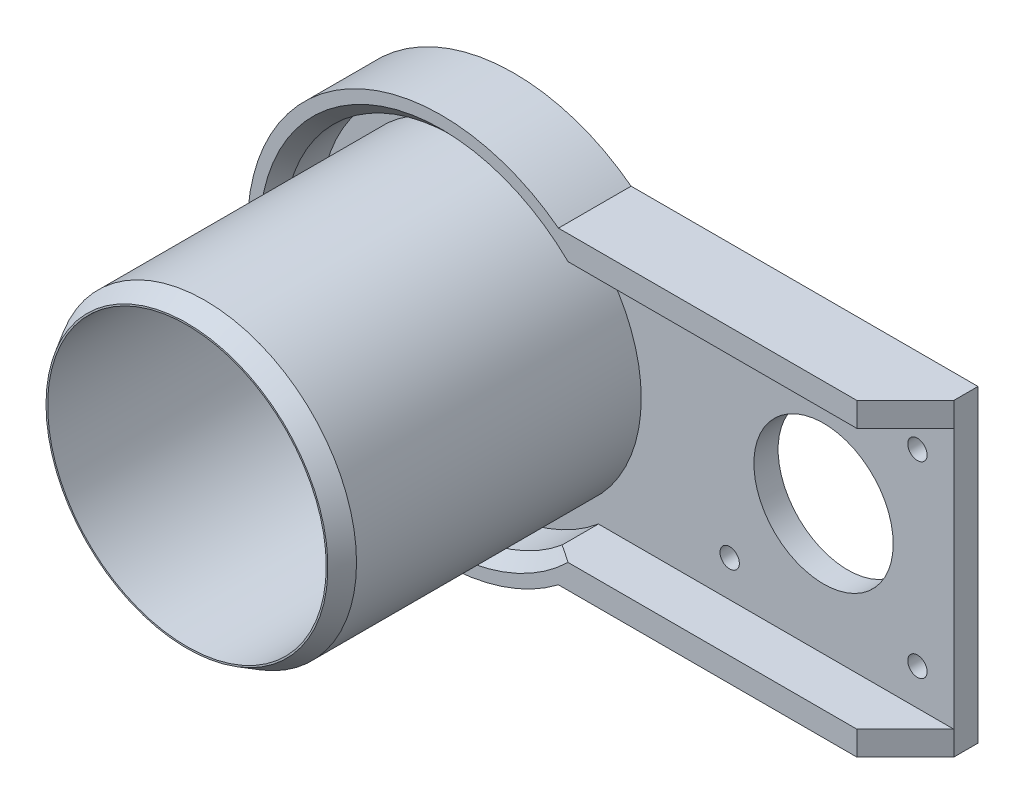
ISO-10303-21;
HEADER;
FILE_DESCRIPTION(('STEP AP214'),'2;1');
FILE_NAME('part.step','',(''),(''),'','','');
FILE_SCHEMA(('AUTOMOTIVE_DESIGN { 1 0 10303 214 1 1 1 1 }'));
ENDSEC;
DATA;
#1=APPLICATION_CONTEXT('core data for automotive mechanical design processes');
#2=APPLICATION_PROTOCOL_DEFINITION('international standard','automotive_design',2000,#1);
#3=PRODUCT_CONTEXT('',#1,'mechanical');
#4=PRODUCT('Part','Part','',(#3));
#5=PRODUCT_RELATED_PRODUCT_CATEGORY('part','',(#4));
#6=PRODUCT_DEFINITION_FORMATION('','',#4);
#7=PRODUCT_DEFINITION_CONTEXT('part definition',#1,'design');
#8=PRODUCT_DEFINITION('design','',#6,#7);
#9=PRODUCT_DEFINITION_SHAPE('','',#8);
#10=(LENGTH_UNIT() NAMED_UNIT(*) SI_UNIT(.MILLI.,.METRE.));
#11=(NAMED_UNIT(*) PLANE_ANGLE_UNIT() SI_UNIT($,.RADIAN.));
#12=(NAMED_UNIT(*) SI_UNIT($,.STERADIAN.) SOLID_ANGLE_UNIT());
#13=UNCERTAINTY_MEASURE_WITH_UNIT(LENGTH_MEASURE(1.E-05),#10,'distance_accuracy_value','');
#14=(GEOMETRIC_REPRESENTATION_CONTEXT(3) GLOBAL_UNCERTAINTY_ASSIGNED_CONTEXT((#13)) GLOBAL_UNIT_ASSIGNED_CONTEXT((#10,
#11,#12)) REPRESENTATION_CONTEXT('',''));
#15=CARTESIAN_POINT('',(0.,0.,0.));
#16=DIRECTION('',(0.,0.,1.));
#17=DIRECTION('',(1.,0.,0.));
#18=AXIS2_PLACEMENT_3D('',#15,#16,#17);
#19=CARTESIAN_POINT('',(0.,0.,4.));
#20=DIRECTION('',(0.,0.,1.));
#21=DIRECTION('',(1.,0.,0.));
#22=AXIS2_PLACEMENT_3D('',#19,#20,#21);
#23=PLANE('',#22);
#24=CARTESIAN_POINT('',(0.,0.,4.));
#25=DIRECTION('',(0.,0.,1.));
#26=DIRECTION('',(1.,0.,0.));
#27=AXIS2_PLACEMENT_3D('',#24,#25,#26);
#28=CIRCLE('',#27,25.);
#29=CARTESIAN_POINT('',(25.,0.,4.));
#30=VERTEX_POINT('',#29);
#31=EDGE_CURVE('E166',#30,#30,#28,.T.);
#32=ORIENTED_EDGE('',*,*,#31,.F.);
#33=EDGE_LOOP('',(#32));
#34=FACE_BOUND('',#33,.T.);
#35=CARTESIAN_POINT('',(70.6000000000003,-15.5,4.));
#36=DIRECTION('',(0.,0.,1.));
#37=DIRECTION('',(1.,0.,0.));
#38=AXIS2_PLACEMENT_3D('',#35,#36,#37);
#39=CIRCLE('',#38,1.59999999999999);
#40=CARTESIAN_POINT('',(72.2000000000003,-15.5,4.));
#41=VERTEX_POINT('',#40);
#42=EDGE_CURVE('E176',#41,#41,#39,.T.);
#43=ORIENTED_EDGE('',*,*,#42,.F.);
#44=EDGE_LOOP('',(#43));
#45=FACE_BOUND('',#44,.T.);
#46=CARTESIAN_POINT('',(39.6,15.5,4.));
#47=DIRECTION('',(0.,0.,1.));
#48=DIRECTION('',(1.,0.,0.));
#49=AXIS2_PLACEMENT_3D('',#46,#47,#48);
#50=CIRCLE('',#49,1.6);
#51=CARTESIAN_POINT('',(41.2,15.5,4.));
#52=VERTEX_POINT('',#51);
#53=EDGE_CURVE('E188',#52,#52,#50,.T.);
#54=ORIENTED_EDGE('',*,*,#53,.F.);
#55=EDGE_LOOP('',(#54));
#56=FACE_BOUND('',#55,.T.);
#57=CARTESIAN_POINT('',(55.1,0.,4.));
#58=DIRECTION('',(0.,0.,1.));
#59=DIRECTION('',(1.,0.,0.));
#60=AXIS2_PLACEMENT_3D('',#57,#58,#59);
#61=CIRCLE('',#60,11.5);
#62=CARTESIAN_POINT('',(66.6,0.,4.));
#63=VERTEX_POINT('',#62);
#64=EDGE_CURVE('E194',#63,#63,#61,.T.);
#65=ORIENTED_EDGE('',*,*,#64,.F.);
#66=EDGE_LOOP('',(#65));
#67=FACE_BOUND('',#66,.T.);
#68=CARTESIAN_POINT('',(70.6,15.5,4.));
#69=DIRECTION('',(0.,0.,1.));
#70=DIRECTION('',(1.,0.,0.));
#71=AXIS2_PLACEMENT_3D('',#68,#69,#70);
#72=CIRCLE('',#71,1.6);
#73=CARTESIAN_POINT('',(72.2,15.5,4.));
#74=VERTEX_POINT('',#73);
#75=EDGE_CURVE('E182',#74,#74,#72,.T.);
#76=ORIENTED_EDGE('',*,*,#75,.F.);
#77=EDGE_LOOP('',(#76));
#78=FACE_BOUND('',#77,.T.);
#79=CARTESIAN_POINT('',(39.6000000000003,-15.5,4.));
#80=DIRECTION('',(0.,0.,1.));
#81=DIRECTION('',(1.,0.,0.));
#82=AXIS2_PLACEMENT_3D('',#79,#80,#81);
#83=CIRCLE('',#82,1.6);
#84=CARTESIAN_POINT('',(41.2000000000003,-15.5,4.));
#85=VERTEX_POINT('',#84);
#86=EDGE_CURVE('E170',#85,#85,#83,.T.);
#87=ORIENTED_EDGE('',*,*,#86,.F.);
#88=EDGE_LOOP('',(#87));
#89=FACE_BOUND('',#88,.T.);
#90=CARTESIAN_POINT('',(0.,0.,4.));
#91=DIRECTION('',(0.,0.,-1.));
#92=DIRECTION('',(1.,0.,0.));
#93=AXIS2_PLACEMENT_3D('',#90,#91,#92);
#94=CIRCLE('',#93,28.);
#95=CARTESIAN_POINT('',(17.9373911146521,-21.5,4.));
#96=VERTEX_POINT('',#95);
#97=CARTESIAN_POINT('',(17.9373911146521,21.5,4.));
#98=VERTEX_POINT('',#97);
#99=EDGE_CURVE('E147',#96,#98,#94,.T.);
#100=ORIENTED_EDGE('',*,*,#99,.F.);
#101=DIRECTION('',(-1.,0.,0.));
#102=VECTOR('',#101,1.);
#103=CARTESIAN_POINT('',(17.9373911146521,-21.5,4.));
#104=LINE('',#103,#102);
#105=CARTESIAN_POINT('',(76.6,-21.5,4.));
#106=VERTEX_POINT('',#105);
#107=EDGE_CURVE('E155',#106,#96,#104,.T.);
#108=ORIENTED_EDGE('',*,*,#107,.F.);
#109=DIRECTION('',(0.,1.,0.));
#110=VECTOR('',#109,1.);
#111=CARTESIAN_POINT('',(76.6,25.5,4.));
#112=LINE('',#111,#110);
#113=CARTESIAN_POINT('',(76.6,21.5,4.));
#114=VERTEX_POINT('',#113);
#115=EDGE_CURVE('E205',#106,#114,#112,.T.);
#116=ORIENTED_EDGE('',*,*,#115,.T.);
#117=DIRECTION('',(1.,0.,0.));
#118=VECTOR('',#117,1.);
#119=CARTESIAN_POINT('',(76.6,21.5,4.));
#120=LINE('',#119,#118);
#121=EDGE_CURVE('E144',#98,#114,#120,.T.);
#122=ORIENTED_EDGE('',*,*,#121,.F.);
#123=EDGE_LOOP('',(#100,#108,#116,#122));
#124=FACE_BOUND('',#123,.T.);
#125=ADVANCED_FACE('F33',(#34,#45,#56,#67,#78,#89,#124),#23,.T.);
#126=CARTESIAN_POINT('',(0.,0.,4.));
#127=DIRECTION('',(0.,0.,1.));
#128=DIRECTION('',(1.,0.,0.));
#129=AXIS2_PLACEMENT_3D('',#126,#127,#128);
#130=CIRCLE('',#129,6.55);
#131=CARTESIAN_POINT('',(6.55,0.,4.));
#132=VERTEX_POINT('',#131);
#133=EDGE_CURVE('E200',#132,#132,#130,.T.);
#134=ORIENTED_EDGE('',*,*,#133,.F.);
#135=EDGE_LOOP('',(#134));
#136=FACE_BOUND('',#135,.T.);
#137=CARTESIAN_POINT('',(0.,0.,4.));
#138=DIRECTION('',(0.,0.,1.));
#139=DIRECTION('',(1.,0.,0.));
#140=AXIS2_PLACEMENT_3D('',#137,#138,#139);
#141=CIRCLE('',#140,23.);
#142=CARTESIAN_POINT('',(23.,0.,4.));
#143=VERTEX_POINT('',#142);
#144=EDGE_CURVE('E124',#143,#143,#141,.F.);
#145=ORIENTED_EDGE('',*,*,#144,.F.);
#146=EDGE_LOOP('',(#145));
#147=FACE_BOUND('',#146,.T.);
#148=ADVANCED_FACE('F304',(#136,#147),#23,.T.);
#149=CARTESIAN_POINT('',(0.,0.,0.));
#150=DIRECTION('',(0.,0.,1.));
#151=DIRECTION('',(1.,0.,0.));
#152=AXIS2_PLACEMENT_3D('',#149,#150,#151);
#153=PLANE('',#152);
#154=CARTESIAN_POINT('',(0.,0.,0.));
#155=DIRECTION('',(0.,0.,1.));
#156=DIRECTION('',(1.,0.,0.));
#157=AXIS2_PLACEMENT_3D('',#154,#155,#156);
#158=CIRCLE('',#157,32.);
#159=CARTESIAN_POINT('',(19.3326149291812,25.5,0.));
#160=VERTEX_POINT('',#159);
#161=CARTESIAN_POINT('',(19.3326149291812,-25.5,0.));
#162=VERTEX_POINT('',#161);
#163=EDGE_CURVE('E121',#160,#162,#158,.T.);
#164=ORIENTED_EDGE('',*,*,#163,.F.);
#165=DIRECTION('',(-1.,0.,0.));
#166=VECTOR('',#165,1.);
#167=CARTESIAN_POINT('',(19.3326149291812,25.5,0.));
#168=LINE('',#167,#166);
#169=CARTESIAN_POINT('',(76.6,25.5,0.));
#170=VERTEX_POINT('',#169);
#171=EDGE_CURVE('E209',#170,#160,#168,.T.);
#172=ORIENTED_EDGE('',*,*,#171,.F.);
#173=DIRECTION('',(0.,1.,0.));
#174=VECTOR('',#173,1.);
#175=CARTESIAN_POINT('',(76.6,25.5,0.));
#176=LINE('',#175,#174);
#177=CARTESIAN_POINT('',(76.6,-25.5,0.));
#178=VERTEX_POINT('',#177);
#179=EDGE_CURVE('E213',#178,#170,#176,.T.);
#180=ORIENTED_EDGE('',*,*,#179,.F.);
#181=DIRECTION('',(1.,0.,0.));
#182=VECTOR('',#181,1.);
#183=CARTESIAN_POINT('',(76.6,-25.5,0.));
#184=LINE('',#183,#182);
#185=EDGE_CURVE('E211',#162,#178,#184,.T.);
#186=ORIENTED_EDGE('',*,*,#185,.F.);
#187=EDGE_LOOP('',(#164,#172,#180,#186));
#188=FACE_BOUND('',#187,.T.);
#189=CARTESIAN_POINT('',(0.,0.,0.));
#190=DIRECTION('',(0.,0.,1.));
#191=DIRECTION('',(1.,0.,0.));
#192=AXIS2_PLACEMENT_3D('',#189,#190,#191);
#193=CIRCLE('',#192,6.55);
#194=CARTESIAN_POINT('',(6.55,0.,0.));
#195=VERTEX_POINT('',#194);
#196=EDGE_CURVE('E197',#195,#195,#193,.T.);
#197=ORIENTED_EDGE('',*,*,#196,.T.);
#198=EDGE_LOOP('',(#197));
#199=FACE_BOUND('',#198,.T.);
#200=CARTESIAN_POINT('',(55.1,0.,0.));
#201=DIRECTION('',(0.,0.,1.));
#202=DIRECTION('',(1.,0.,0.));
#203=AXIS2_PLACEMENT_3D('',#200,#201,#202);
#204=CIRCLE('',#203,11.5);
#205=CARTESIAN_POINT('',(66.6,0.,0.));
#206=VERTEX_POINT('',#205);
#207=EDGE_CURVE('E191',#206,#206,#204,.T.);
#208=ORIENTED_EDGE('',*,*,#207,.T.);
#209=EDGE_LOOP('',(#208));
#210=FACE_BOUND('',#209,.T.);
#211=CARTESIAN_POINT('',(39.6,15.5,0.));
#212=DIRECTION('',(0.,0.,1.));
#213=DIRECTION('',(1.,0.,0.));
#214=AXIS2_PLACEMENT_3D('',#211,#212,#213);
#215=CIRCLE('',#214,1.6);
#216=CARTESIAN_POINT('',(41.2,15.5,0.));
#217=VERTEX_POINT('',#216);
#218=EDGE_CURVE('E185',#217,#217,#215,.T.);
#219=ORIENTED_EDGE('',*,*,#218,.T.);
#220=EDGE_LOOP('',(#219));
#221=FACE_BOUND('',#220,.T.);
#222=CARTESIAN_POINT('',(70.6,15.5,0.));
#223=DIRECTION('',(0.,0.,1.));
#224=DIRECTION('',(1.,0.,0.));
#225=AXIS2_PLACEMENT_3D('',#222,#223,#224);
#226=CIRCLE('',#225,1.6);
#227=CARTESIAN_POINT('',(72.2,15.5,0.));
#228=VERTEX_POINT('',#227);
#229=EDGE_CURVE('E179',#228,#228,#226,.T.);
#230=ORIENTED_EDGE('',*,*,#229,.T.);
#231=EDGE_LOOP('',(#230));
#232=FACE_BOUND('',#231,.T.);
#233=CARTESIAN_POINT('',(70.6000000000003,-15.5,0.));
#234=DIRECTION('',(0.,0.,1.));
#235=DIRECTION('',(1.,0.,0.));
#236=AXIS2_PLACEMENT_3D('',#233,#234,#235);
#237=CIRCLE('',#236,1.59999999999999);
#238=CARTESIAN_POINT('',(72.2000000000003,-15.5,0.));
#239=VERTEX_POINT('',#238);
#240=EDGE_CURVE('E173',#239,#239,#237,.T.);
#241=ORIENTED_EDGE('',*,*,#240,.T.);
#242=EDGE_LOOP('',(#241));
#243=FACE_BOUND('',#242,.T.);
#244=CARTESIAN_POINT('',(39.6000000000003,-15.5,0.));
#245=DIRECTION('',(0.,0.,1.));
#246=DIRECTION('',(1.,0.,0.));
#247=AXIS2_PLACEMENT_3D('',#244,#245,#246);
#248=CIRCLE('',#247,1.6);
#249=CARTESIAN_POINT('',(41.2000000000003,-15.5,0.));
#250=VERTEX_POINT('',#249);
#251=EDGE_CURVE('E169',#250,#250,#248,.T.);
#252=ORIENTED_EDGE('',*,*,#251,.T.);
#253=EDGE_LOOP('',(#252));
#254=FACE_BOUND('',#253,.T.);
#255=ADVANCED_FACE('F306',(#188,#199,#210,#221,#232,#243,#254),#153,.F.);
#256=CARTESIAN_POINT('',(0.,0.,4.));
#257=DIRECTION('',(0.,0.,-1.));
#258=DIRECTION('',(-1.,0.,0.));
#259=AXIS2_PLACEMENT_3D('',#256,#257,#258);
#260=CYLINDRICAL_SURFACE('',#259,32.);
#261=ORIENTED_EDGE('',*,*,#163,.T.);
#262=DIRECTION('',(0.,0.,-1.));
#263=VECTOR('',#262,1.);
#264=CARTESIAN_POINT('',(19.3326149291812,-25.5,4.));
#265=LINE('',#264,#263);
#266=CARTESIAN_POINT('',(19.3326149291812,-25.5,12.));
#267=VERTEX_POINT('',#266);
#268=EDGE_CURVE('E114',#267,#162,#265,.T.);
#269=ORIENTED_EDGE('',*,*,#268,.F.);
#270=CARTESIAN_POINT('',(0.,0.,12.));
#271=DIRECTION('',(0.,0.,1.));
#272=DIRECTION('',(1.,0.,0.));
#273=AXIS2_PLACEMENT_3D('',#270,#271,#272);
#274=CIRCLE('',#273,32.);
#275=CARTESIAN_POINT('',(19.3326149291812,25.5,12.));
#276=VERTEX_POINT('',#275);
#277=EDGE_CURVE('E119',#276,#267,#274,.T.);
#278=ORIENTED_EDGE('',*,*,#277,.F.);
#279=DIRECTION('',(0.,0.,-1.));
#280=VECTOR('',#279,1.);
#281=CARTESIAN_POINT('',(19.3326149291812,25.5,4.));
#282=LINE('',#281,#280);
#283=EDGE_CURVE('E208',#276,#160,#282,.T.);
#284=ORIENTED_EDGE('',*,*,#283,.T.);
#285=EDGE_LOOP('',(#261,#269,#278,#284));
#286=FACE_BOUND('',#285,.T.);
#287=ADVANCED_FACE('F116',(#286),#260,.T.);
#288=CARTESIAN_POINT('',(76.6,-25.5,4.));
#289=DIRECTION('',(0.,1.,0.));
#290=DIRECTION('',(-1.,0.,0.));
#291=AXIS2_PLACEMENT_3D('',#288,#289,#290);
#292=PLANE('',#291);
#293=DIRECTION('',(0.,0.,-1.));
#294=VECTOR('',#293,1.);
#295=CARTESIAN_POINT('',(76.6,-25.5,4.));
#296=LINE('',#295,#294);
#297=CARTESIAN_POINT('',(76.6,-25.5,3.99999999999998));
#298=VERTEX_POINT('',#297);
#299=EDGE_CURVE('E125',#298,#178,#296,.T.);
#300=ORIENTED_EDGE('',*,*,#299,.F.);
#301=DIRECTION('',(-0.707106781186547,0.,0.707106781186548));
#302=VECTOR('',#301,1.);
#303=CARTESIAN_POINT('',(68.6,-25.5,12.));
#304=LINE('',#303,#302);
#305=CARTESIAN_POINT('',(68.6,-25.5,12.));
#306=VERTEX_POINT('',#305);
#307=EDGE_CURVE('E132',#298,#306,#304,.T.);
#308=ORIENTED_EDGE('',*,*,#307,.T.);
#309=DIRECTION('',(1.,0.,0.));
#310=VECTOR('',#309,1.);
#311=CARTESIAN_POINT('',(19.3326149291812,-25.5,12.));
#312=LINE('',#311,#310);
#313=EDGE_CURVE('E128',#267,#306,#312,.T.);
#314=ORIENTED_EDGE('',*,*,#313,.F.);
#315=ORIENTED_EDGE('',*,*,#268,.T.);
#316=ORIENTED_EDGE('',*,*,#185,.T.);
#317=EDGE_LOOP('',(#300,#308,#314,#315,#316));
#318=FACE_BOUND('',#317,.T.);
#319=ADVANCED_FACE('F130',(#318),#292,.F.);
#320=CARTESIAN_POINT('',(76.6,25.5,4.));
#321=DIRECTION('',(-1.,0.,0.));
#322=DIRECTION('',(0.,0.,1.));
#323=AXIS2_PLACEMENT_3D('',#320,#321,#322);
#324=PLANE('',#323);
#325=ORIENTED_EDGE('',*,*,#115,.F.);
#326=DIRECTION('',(0.,-1.,0.));
#327=VECTOR('',#326,1.);
#328=CARTESIAN_POINT('',(76.6,-25.5,3.99999999999998));
#329=LINE('',#328,#327);
#330=EDGE_CURVE('E237',#106,#298,#329,.T.);
#331=ORIENTED_EDGE('',*,*,#330,.T.);
#332=ORIENTED_EDGE('',*,*,#299,.T.);
#333=ORIENTED_EDGE('',*,*,#179,.T.);
#334=DIRECTION('',(0.,0.,-1.));
#335=VECTOR('',#334,1.);
#336=CARTESIAN_POINT('',(76.6,25.5,4.));
#337=LINE('',#336,#335);
#338=CARTESIAN_POINT('',(76.6,25.5,3.99999999999998));
#339=VERTEX_POINT('',#338);
#340=EDGE_CURVE('E218',#339,#170,#337,.T.);
#341=ORIENTED_EDGE('',*,*,#340,.F.);
#342=DIRECTION('',(0.,-1.,0.));
#343=VECTOR('',#342,1.);
#344=CARTESIAN_POINT('',(76.6,21.5,3.99999999999998));
#345=LINE('',#344,#343);
#346=EDGE_CURVE('E235',#339,#114,#345,.T.);
#347=ORIENTED_EDGE('',*,*,#346,.T.);
#348=EDGE_LOOP('',(#325,#331,#332,#333,#341,#347));
#349=FACE_BOUND('',#348,.T.);
#350=ADVANCED_FACE('F312',(#349),#324,.F.);
#351=CARTESIAN_POINT('',(19.3326149291812,25.5,4.));
#352=DIRECTION('',(0.,-1.,0.));
#353=DIRECTION('',(1.,0.,0.));
#354=AXIS2_PLACEMENT_3D('',#351,#352,#353);
#355=PLANE('',#354);
#356=DIRECTION('',(-1.,0.,0.));
#357=VECTOR('',#356,1.);
#358=CARTESIAN_POINT('',(76.6,25.5,12.));
#359=LINE('',#358,#357);
#360=CARTESIAN_POINT('',(68.6,25.5,12.));
#361=VERTEX_POINT('',#360);
#362=EDGE_CURVE('E142',#361,#276,#359,.T.);
#363=ORIENTED_EDGE('',*,*,#362,.F.);
#364=DIRECTION('',(0.707106781186547,0.,-0.707106781186548));
#365=VECTOR('',#364,1.);
#366=CARTESIAN_POINT('',(68.6,25.5,12.));
#367=LINE('',#366,#365);
#368=EDGE_CURVE('E240',#361,#339,#367,.T.);
#369=ORIENTED_EDGE('',*,*,#368,.T.);
#370=ORIENTED_EDGE('',*,*,#340,.T.);
#371=ORIENTED_EDGE('',*,*,#171,.T.);
#372=ORIENTED_EDGE('',*,*,#283,.F.);
#373=EDGE_LOOP('',(#363,#369,#370,#371,#372));
#374=FACE_BOUND('',#373,.T.);
#375=ADVANCED_FACE('F300',(#374),#355,.F.);
#376=CARTESIAN_POINT('',(0.,0.,4.));
#377=DIRECTION('',(0.,0.,-1.));
#378=DIRECTION('',(-1.,0.,0.));
#379=AXIS2_PLACEMENT_3D('',#376,#377,#378);
#380=CYLINDRICAL_SURFACE('',#379,6.55);
#381=ORIENTED_EDGE('',*,*,#133,.T.);
#382=EDGE_LOOP('',(#381));
#383=FACE_BOUND('',#382,.T.);
#384=ORIENTED_EDGE('',*,*,#196,.F.);
#385=EDGE_LOOP('',(#384));
#386=FACE_BOUND('',#385,.T.);
#387=ADVANCED_FACE('F296',(#383,#386),#380,.F.);
#388=CARTESIAN_POINT('',(55.1,0.,4.));
#389=DIRECTION('',(0.,0.,-1.));
#390=DIRECTION('',(-1.,0.,0.));
#391=AXIS2_PLACEMENT_3D('',#388,#389,#390);
#392=CYLINDRICAL_SURFACE('',#391,11.5);
#393=ORIENTED_EDGE('',*,*,#64,.T.);
#394=EDGE_LOOP('',(#393));
#395=FACE_BOUND('',#394,.T.);
#396=ORIENTED_EDGE('',*,*,#207,.F.);
#397=EDGE_LOOP('',(#396));
#398=FACE_BOUND('',#397,.T.);
#399=ADVANCED_FACE('F292',(#395,#398),#392,.F.);
#400=CARTESIAN_POINT('',(39.6,15.5,4.));
#401=DIRECTION('',(0.,0.,-1.));
#402=DIRECTION('',(-1.,0.,0.));
#403=AXIS2_PLACEMENT_3D('',#400,#401,#402);
#404=CYLINDRICAL_SURFACE('',#403,1.6);
#405=ORIENTED_EDGE('',*,*,#53,.T.);
#406=EDGE_LOOP('',(#405));
#407=FACE_BOUND('',#406,.T.);
#408=ORIENTED_EDGE('',*,*,#218,.F.);
#409=EDGE_LOOP('',(#408));
#410=FACE_BOUND('',#409,.T.);
#411=ADVANCED_FACE('F288',(#407,#410),#404,.F.);
#412=CARTESIAN_POINT('',(70.6,15.5,4.));
#413=DIRECTION('',(0.,0.,-1.));
#414=DIRECTION('',(-1.,0.,0.));
#415=AXIS2_PLACEMENT_3D('',#412,#413,#414);
#416=CYLINDRICAL_SURFACE('',#415,1.6);
#417=ORIENTED_EDGE('',*,*,#75,.T.);
#418=EDGE_LOOP('',(#417));
#419=FACE_BOUND('',#418,.T.);
#420=ORIENTED_EDGE('',*,*,#229,.F.);
#421=EDGE_LOOP('',(#420));
#422=FACE_BOUND('',#421,.T.);
#423=ADVANCED_FACE('F284',(#419,#422),#416,.F.);
#424=CARTESIAN_POINT('',(70.6000000000003,-15.5,4.));
#425=DIRECTION('',(0.,0.,-1.));
#426=DIRECTION('',(-1.,0.,0.));
#427=AXIS2_PLACEMENT_3D('',#424,#425,#426);
#428=CYLINDRICAL_SURFACE('',#427,1.59999999999999);
#429=ORIENTED_EDGE('',*,*,#42,.T.);
#430=EDGE_LOOP('',(#429));
#431=FACE_BOUND('',#430,.T.);
#432=ORIENTED_EDGE('',*,*,#240,.F.);
#433=EDGE_LOOP('',(#432));
#434=FACE_BOUND('',#433,.T.);
#435=ADVANCED_FACE('F280',(#431,#434),#428,.F.);
#436=CARTESIAN_POINT('',(39.6000000000003,-15.5,4.));
#437=DIRECTION('',(0.,0.,-1.));
#438=DIRECTION('',(-1.,0.,0.));
#439=AXIS2_PLACEMENT_3D('',#436,#437,#438);
#440=CYLINDRICAL_SURFACE('',#439,1.6);
#441=ORIENTED_EDGE('',*,*,#86,.T.);
#442=EDGE_LOOP('',(#441));
#443=FACE_BOUND('',#442,.T.);
#444=ORIENTED_EDGE('',*,*,#251,.F.);
#445=EDGE_LOOP('',(#444));
#446=FACE_BOUND('',#445,.T.);
#447=ADVANCED_FACE('F273',(#443,#446),#440,.F.);
#448=CARTESIAN_POINT('',(0.,0.,54.));
#449=DIRECTION('',(0.,0.,1.));
#450=DIRECTION('',(1.,0.,0.));
#451=AXIS2_PLACEMENT_3D('',#448,#449,#450);
#452=PLANE('',#451);
#453=CARTESIAN_POINT('',(0.,0.,54.));
#454=DIRECTION('',(0.,0.,1.));
#455=DIRECTION('',(1.,0.,0.));
#456=AXIS2_PLACEMENT_3D('',#453,#454,#455);
#457=CIRCLE('',#456,23.2679491924311);
#458=CARTESIAN_POINT('',(-23.2679491924312,0.,54.));
#459=VERTEX_POINT('',#458);
#460=EDGE_CURVE('E223',#459,#459,#457,.T.);
#461=ORIENTED_EDGE('',*,*,#460,.T.);
#462=EDGE_LOOP('',(#461));
#463=FACE_BOUND('',#462,.T.);
#464=CARTESIAN_POINT('',(0.,0.,54.));
#465=DIRECTION('',(0.,0.,1.));
#466=DIRECTION('',(1.,0.,0.));
#467=AXIS2_PLACEMENT_3D('',#464,#465,#466);
#468=CIRCLE('',#467,23.);
#469=CARTESIAN_POINT('',(23.,0.,54.));
#470=VERTEX_POINT('',#469);
#471=EDGE_CURVE('E163',#470,#470,#468,.T.);
#472=ORIENTED_EDGE('',*,*,#471,.F.);
#473=EDGE_LOOP('',(#472));
#474=FACE_BOUND('',#473,.T.);
#475=ADVANCED_FACE('F270',(#463,#474),#452,.T.);
#476=CARTESIAN_POINT('',(0.,0.,54.));
#477=DIRECTION('',(0.,0.,-1.));
#478=DIRECTION('',(-1.,0.,0.));
#479=AXIS2_PLACEMENT_3D('',#476,#477,#478);
#480=CYLINDRICAL_SURFACE('',#479,25.);
#481=CARTESIAN_POINT('',(0.,0.,51.));
#482=DIRECTION('',(0.,0.,1.));
#483=DIRECTION('',(1.,0.,0.));
#484=AXIS2_PLACEMENT_3D('',#481,#482,#483);
#485=CIRCLE('',#484,25.);
#486=CARTESIAN_POINT('',(-25.,0.,51.));
#487=VERTEX_POINT('',#486);
#488=EDGE_CURVE('E226',#487,#487,#485,.F.);
#489=ORIENTED_EDGE('',*,*,#488,.T.);
#490=EDGE_LOOP('',(#489));
#491=FACE_BOUND('',#490,.T.);
#492=ORIENTED_EDGE('',*,*,#31,.T.);
#493=EDGE_LOOP('',(#492));
#494=FACE_BOUND('',#493,.T.);
#495=ADVANCED_FACE('F268',(#491,#494),#480,.T.);
#496=CARTESIAN_POINT('',(0.,0.,54.));
#497=DIRECTION('',(0.,0.,-1.));
#498=DIRECTION('',(-1.,0.,0.));
#499=AXIS2_PLACEMENT_3D('',#496,#497,#498);
#500=CYLINDRICAL_SURFACE('',#499,23.);
#501=ORIENTED_EDGE('',*,*,#471,.T.);
#502=EDGE_LOOP('',(#501));
#503=FACE_BOUND('',#502,.T.);
#504=ORIENTED_EDGE('',*,*,#144,.T.);
#505=EDGE_LOOP('',(#504));
#506=FACE_BOUND('',#505,.T.);
#507=ADVANCED_FACE('F265',(#503,#506),#500,.F.);
#508=CARTESIAN_POINT('',(0.,0.,54.));
#509=DIRECTION('',(0.,0.,-1.));
#510=DIRECTION('',(-1.,0.,0.));
#511=AXIS2_PLACEMENT_3D('',#508,#509,#510);
#512=CONICAL_SURFACE('',#511,23.2679491924311,0.523598775598296);
#513=CARTESIAN_POINT('',(-25.,0.,51.));
#514=CARTESIAN_POINT('',(-24.9819578040878,0.,51.03125));
#515=CARTESIAN_POINT('',(-24.9639156081757,0.,51.0625));
#516=CARTESIAN_POINT('',(-24.9278312163513,0.,51.125));
#517=CARTESIAN_POINT('',(-24.9097890204391,0.,51.15625));
#518=CARTESIAN_POINT('',(-24.8737046286148,0.,51.21875));
#519=CARTESIAN_POINT('',(-24.8556624327026,0.,51.25));
#520=CARTESIAN_POINT('',(-24.8195780408783,0.,51.3125));
#521=CARTESIAN_POINT('',(-24.8015358449661,0.,51.34375));
#522=CARTESIAN_POINT('',(-24.7654514531417,0.,51.40625));
#523=CARTESIAN_POINT('',(-24.7474092572295,0.,51.4375));
#524=CARTESIAN_POINT('',(-24.7113248654052,0.,51.5));
#525=CARTESIAN_POINT('',(-24.693282669493,0.,51.53125));
#526=CARTESIAN_POINT('',(-24.6571982776687,0.,51.59375));
#527=CARTESIAN_POINT('',(-24.6391560817565,0.,51.625));
#528=CARTESIAN_POINT('',(-24.6030716899321,0.,51.6875));
#529=CARTESIAN_POINT('',(-24.58502949402,0.,51.71875));
#530=CARTESIAN_POINT('',(-24.5489451021956,0.,51.78125));
#531=CARTESIAN_POINT('',(-24.5309029062834,0.,51.8125));
#532=CARTESIAN_POINT('',(-24.4948185144591,0.,51.875));
#533=CARTESIAN_POINT('',(-24.4767763185469,0.,51.90625));
#534=CARTESIAN_POINT('',(-24.4406919267226,0.,51.96875));
#535=CARTESIAN_POINT('',(-24.4226497308104,0.,52.));
#536=CARTESIAN_POINT('',(-24.386565338986,0.,52.0625));
#537=CARTESIAN_POINT('',(-24.3685231430739,0.,52.09375));
#538=CARTESIAN_POINT('',(-24.3324387512495,0.,52.15625));
#539=CARTESIAN_POINT('',(-24.3143965553373,0.,52.1875));
#540=CARTESIAN_POINT('',(-24.278312163513,0.,52.25));
#541=CARTESIAN_POINT('',(-24.2602699676008,0.,52.28125));
#542=CARTESIAN_POINT('',(-24.2241855757765,0.,52.34375));
#543=CARTESIAN_POINT('',(-24.2061433798643,0.,52.375));
#544=CARTESIAN_POINT('',(-24.1700589880399,0.,52.4375));
#545=CARTESIAN_POINT('',(-24.1520167921278,0.,52.46875));
#546=CARTESIAN_POINT('',(-24.1159324003034,0.,52.53125));
#547=CARTESIAN_POINT('',(-24.0978902043912,0.,52.5625));
#548=CARTESIAN_POINT('',(-24.0618058125669,0.,52.625));
#549=CARTESIAN_POINT('',(-24.0437636166547,0.,52.65625));
#550=CARTESIAN_POINT('',(-24.0076792248303,0.,52.71875));
#551=CARTESIAN_POINT('',(-23.9896370289182,0.,52.75));
#552=CARTESIAN_POINT('',(-23.9535526370938,0.,52.8125));
#553=CARTESIAN_POINT('',(-23.9355104411817,0.,52.84375));
#554=CARTESIAN_POINT('',(-23.8994260493573,0.,52.90625));
#555=CARTESIAN_POINT('',(-23.8813838534451,0.,52.9375));
#556=CARTESIAN_POINT('',(-23.8452994616208,0.,53.));
#557=CARTESIAN_POINT('',(-23.8272572657086,0.,53.03125));
#558=CARTESIAN_POINT('',(-23.7911728738842,0.,53.09375));
#559=CARTESIAN_POINT('',(-23.7731306779721,0.,53.125));
#560=CARTESIAN_POINT('',(-23.7370462861477,0.,53.1875));
#561=CARTESIAN_POINT('',(-23.7190040902355,0.,53.21875));
#562=CARTESIAN_POINT('',(-23.6829196984112,0.,53.28125));
#563=CARTESIAN_POINT('',(-23.664877502499,0.,53.3125));
#564=CARTESIAN_POINT('',(-23.6287931106747,0.,53.375));
#565=CARTESIAN_POINT('',(-23.6107509147625,0.,53.40625));
#566=CARTESIAN_POINT('',(-23.5746665229381,0.,53.46875));
#567=CARTESIAN_POINT('',(-23.556624327026,0.,53.5));
#568=CARTESIAN_POINT('',(-23.5205399352016,0.,53.5625));
#569=CARTESIAN_POINT('',(-23.5024977392894,0.,53.59375));
#570=CARTESIAN_POINT('',(-23.4664133474651,0.,53.65625));
#571=CARTESIAN_POINT('',(-23.4483711515529,0.,53.6875));
#572=CARTESIAN_POINT('',(-23.4122867597286,0.,53.75));
#573=CARTESIAN_POINT('',(-23.3942445638164,0.,53.78125));
#574=CARTESIAN_POINT('',(-23.358160171992,0.,53.84375));
#575=CARTESIAN_POINT('',(-23.3401179760799,0.,53.875));
#576=CARTESIAN_POINT('',(-23.3040335842555,0.,53.9375));
#577=CARTESIAN_POINT('',(-23.2859913883433,0.,53.96875));
#578=CARTESIAN_POINT('',(-23.2679491924312,0.,54.));
#579=B_SPLINE_CURVE_WITH_KNOTS('',3,(#513,#514,#515,#516,#517,#518,#519,#520,#521,#522,#523,
#524,#525,#526,#527,#528,#529,#530,#531,#532,#533,#534,#535,#536,#537,#538,#539,#540,#541,#542,
#543,#544,#545,#546,#547,#548,#549,#550,#551,#552,#553,#554,#555,#556,#557,#558,#559,#560,#561,
#562,#563,#564,#565,#566,#567,#568,#569,#570,#571,#572,#573,#574,#575,#576,#577,#578),
.UNSPECIFIED.,.F.,.F.,(4,2,2,2,2,2,2,2,2,2,2,2,2,2,2,2,2,2,2,2,2,2,2,2,2,2,2,2,2,2,2,2,4),(0.,
0.108253175473058,0.21650635094611,0.324759526419166,0.433012701892218,0.54126587736527,
0.649519052838327,0.757772228311379,0.866025403784431,0.974278579257487,1.08253175473054,
1.1907849302036,1.29903810567665,1.4072912811497,1.51554445662276,1.62379763209581,
1.73205080756886,1.84030398304192,1.94855715851497,2.05681033398803,2.16506350946108,
2.27331668493413,2.38156986040719,2.48982303588024,2.5980762113533,2.70632938682635,
2.8145825622994,2.92283573777246,3.03108891324551,3.13934208871856,3.24759526419162,
3.35584843966467,3.46410161513772),.UNSPECIFIED.);
#580=EDGE_CURVE('BSEAM263',#487,#459,#579,.T.);
#581=ORIENTED_EDGE('',*,*,#488,.F.);
#582=ORIENTED_EDGE('',*,*,#460,.F.);
#583=ORIENTED_EDGE('',*,*,#580,.T.);
#584=ORIENTED_EDGE('',*,*,#580,.F.);
#585=EDGE_LOOP('',(#581,#583,#582,#584));
#586=FACE_BOUND('',#585,.T.);
#587=ADVANCED_FACE('F263',(#586),#512,.T.);
#588=CARTESIAN_POINT('',(17.9373911146521,-21.5,12.));
#589=DIRECTION('',(0.,-1.,0.));
#590=DIRECTION('',(1.,0.,0.));
#591=AXIS2_PLACEMENT_3D('',#588,#589,#590);
#592=PLANE('',#591);
#593=DIRECTION('',(0.,0.,-1.));
#594=VECTOR('',#593,1.);
#595=CARTESIAN_POINT('',(17.9373911146521,-21.5,12.));
#596=LINE('',#595,#594);
#597=CARTESIAN_POINT('',(17.9373911146521,-21.5,9.99999999999999));
#598=VERTEX_POINT('',#597);
#599=EDGE_CURVE('E161',#598,#96,#596,.T.);
#600=ORIENTED_EDGE('',*,*,#599,.F.);
#601=CARTESIAN_POINT('',(17.9373911146521,-21.5,9.99999999999999));
#602=CARTESIAN_POINT('',(18.1895496867455,-21.5,10.1615420718404));
#603=CARTESIAN_POINT('',(18.4407975044485,-21.5,10.3245010975829));
#604=CARTESIAN_POINT('',(18.941543985852,-21.5,10.6530335563245));
#605=CARTESIAN_POINT('',(19.1910428149799,-21.5,10.8186067371121));
#606=CARTESIAN_POINT('',(19.688409504226,-21.5,11.1521773928384));
#607=CARTESIAN_POINT('',(19.9362773806831,-21.5,11.3201748434367));
#608=CARTESIAN_POINT('',(20.4304973761538,-21.5,11.6584357218705));
#609=CARTESIAN_POINT('',(20.6768493475415,-21.5,11.828699365447));
#610=CARTESIAN_POINT('',(20.9224759529077,-21.5,12.));
#611=B_SPLINE_CURVE_WITH_KNOTS('',3,(#601,#602,#603,#604,#605,#606,#607,#608,#609,#610),
.UNSPECIFIED.,.F.,.F.,(4,2,2,2,4),(0.,0.898389130751349,1.79669210900949,2.6949860743377,
3.59336617749523),.UNSPECIFIED.);
#612=CARTESIAN_POINT('',(20.9224759529077,-21.5,12.));
#613=VERTEX_POINT('',#612);
#614=EDGE_CURVE('E11',#598,#613,#611,.T.);
#615=ORIENTED_EDGE('',*,*,#614,.T.);
#616=DIRECTION('',(-1.,0.,0.));
#617=VECTOR('',#616,1.);
#618=CARTESIAN_POINT('',(17.9373911146521,-21.5,12.));
#619=LINE('',#618,#617);
#620=CARTESIAN_POINT('',(68.6,-21.5,12.));
#621=VERTEX_POINT('',#620);
#622=EDGE_CURVE('E136',#621,#613,#619,.T.);
#623=ORIENTED_EDGE('',*,*,#622,.F.);
#624=DIRECTION('',(0.707106781186547,0.,-0.707106781186548));
#625=VECTOR('',#624,1.);
#626=CARTESIAN_POINT('',(68.6,-21.5,12.));
#627=LINE('',#626,#625);
#628=EDGE_CURVE('E233',#621,#106,#627,.T.);
#629=ORIENTED_EDGE('',*,*,#628,.T.);
#630=ORIENTED_EDGE('',*,*,#107,.T.);
#631=EDGE_LOOP('',(#600,#615,#623,#629,#630));
#632=FACE_BOUND('',#631,.T.);
#633=ADVANCED_FACE('F259',(#632),#592,.F.);
#634=CARTESIAN_POINT('',(0.,0.,12.));
#635=DIRECTION('',(0.,0.,-1.));
#636=DIRECTION('',(-1.,0.,0.));
#637=AXIS2_PLACEMENT_3D('',#634,#635,#636);
#638=CYLINDRICAL_SURFACE('',#637,28.);
#639=DIRECTION('',(0.,0.,-1.));
#640=VECTOR('',#639,1.);
#641=CARTESIAN_POINT('',(17.9373911146521,21.5,12.));
#642=LINE('',#641,#640);
#643=CARTESIAN_POINT('',(17.9373911146521,21.5,9.99999999999999));
#644=VERTEX_POINT('',#643);
#645=EDGE_CURVE('E154',#644,#98,#642,.T.);
#646=ORIENTED_EDGE('',*,*,#645,.F.);
#647=CARTESIAN_POINT('',(0.,0.,9.99999999999999));
#648=DIRECTION('',(0.,0.,1.));
#649=DIRECTION('',(1.,0.,0.));
#650=AXIS2_PLACEMENT_3D('',#647,#648,#649);
#651=CIRCLE('',#650,28.);
#652=EDGE_CURVE('E46',#644,#598,#651,.T.);
#653=ORIENTED_EDGE('',*,*,#652,.T.);
#654=ORIENTED_EDGE('',*,*,#599,.T.);
#655=ORIENTED_EDGE('',*,*,#99,.T.);
#656=EDGE_LOOP('',(#646,#653,#654,#655));
#657=FACE_BOUND('',#656,.T.);
#658=ADVANCED_FACE('F257',(#657),#638,.F.);
#659=CARTESIAN_POINT('',(76.6,21.5,12.));
#660=DIRECTION('',(0.,1.,0.));
#661=DIRECTION('',(-1.,0.,0.));
#662=AXIS2_PLACEMENT_3D('',#659,#660,#661);
#663=PLANE('',#662);
#664=DIRECTION('',(1.,0.,0.));
#665=VECTOR('',#664,1.);
#666=CARTESIAN_POINT('',(76.6,21.5,12.));
#667=LINE('',#666,#665);
#668=CARTESIAN_POINT('',(20.9224759529077,21.5,12.));
#669=VERTEX_POINT('',#668);
#670=CARTESIAN_POINT('',(68.6,21.5,12.));
#671=VERTEX_POINT('',#670);
#672=EDGE_CURVE('E151',#669,#671,#667,.T.);
#673=ORIENTED_EDGE('',*,*,#672,.F.);
#674=CARTESIAN_POINT('',(20.9224759529077,21.5,12.));
#675=CARTESIAN_POINT('',(20.6768493475415,21.5,11.828699365447));
#676=CARTESIAN_POINT('',(20.4304973761538,21.5,11.6584357218706));
#677=CARTESIAN_POINT('',(19.9362773806831,21.5,11.3201748434367));
#678=CARTESIAN_POINT('',(19.688409504226,21.5,11.1521773928384));
#679=CARTESIAN_POINT('',(19.1910428149799,21.5,10.8186067371121));
#680=CARTESIAN_POINT('',(18.941543985852,21.5,10.6530335563245));
#681=CARTESIAN_POINT('',(18.4407975044485,21.5,10.3245010975829));
#682=CARTESIAN_POINT('',(18.1895496867455,21.5,10.1615420718404));
#683=CARTESIAN_POINT('',(17.9373911146521,21.5,9.99999999999999));
#684=B_SPLINE_CURVE_WITH_KNOTS('',3,(#674,#675,#676,#677,#678,#679,#680,#681,#682,#683),
.UNSPECIFIED.,.F.,.F.,(4,2,2,2,4),(0.,0.898380103157528,1.79667406848574,2.69497704674388,
3.59336617749523),.UNSPECIFIED.);
#685=EDGE_CURVE('E60',#669,#644,#684,.T.);
#686=ORIENTED_EDGE('',*,*,#685,.T.);
#687=ORIENTED_EDGE('',*,*,#645,.T.);
#688=ORIENTED_EDGE('',*,*,#121,.T.);
#689=DIRECTION('',(-0.707106781186547,0.,0.707106781186548));
#690=VECTOR('',#689,1.);
#691=CARTESIAN_POINT('',(68.6,21.5,12.));
#692=LINE('',#691,#690);
#693=EDGE_CURVE('E242',#114,#671,#692,.T.);
#694=ORIENTED_EDGE('',*,*,#693,.T.);
#695=EDGE_LOOP('',(#673,#686,#687,#688,#694));
#696=FACE_BOUND('',#695,.T.);
#697=ADVANCED_FACE('F252',(#696),#663,.F.);
#698=CARTESIAN_POINT('',(0.,0.,12.));
#699=DIRECTION('',(0.,0.,1.));
#700=DIRECTION('',(1.,0.,0.));
#701=AXIS2_PLACEMENT_3D('',#698,#699,#700);
#702=PLANE('',#701);
#703=ORIENTED_EDGE('',*,*,#622,.T.);
#704=CARTESIAN_POINT('',(0.,0.,12.));
#705=DIRECTION('',(0.,0.,1.));
#706=DIRECTION('',(1.,0.,0.));
#707=AXIS2_PLACEMENT_3D('',#704,#705,#706);
#708=CIRCLE('',#707,30.);
#709=EDGE_CURVE('E245',#613,#669,#708,.F.);
#710=ORIENTED_EDGE('',*,*,#709,.T.);
#711=ORIENTED_EDGE('',*,*,#672,.T.);
#712=DIRECTION('',(0.,1.,0.));
#713=VECTOR('',#712,1.);
#714=CARTESIAN_POINT('',(68.6,25.5,12.));
#715=LINE('',#714,#713);
#716=EDGE_CURVE('E229',#671,#361,#715,.T.);
#717=ORIENTED_EDGE('',*,*,#716,.T.);
#718=ORIENTED_EDGE('',*,*,#362,.T.);
#719=ORIENTED_EDGE('',*,*,#277,.T.);
#720=ORIENTED_EDGE('',*,*,#313,.T.);
#721=DIRECTION('',(0.,1.,0.));
#722=VECTOR('',#721,1.);
#723=CARTESIAN_POINT('',(68.6,-21.5,12.));
#724=LINE('',#723,#722);
#725=EDGE_CURVE('E231',#306,#621,#724,.T.);
#726=ORIENTED_EDGE('',*,*,#725,.T.);
#727=EDGE_LOOP('',(#703,#710,#711,#717,#718,#719,#720,#726));
#728=FACE_BOUND('',#727,.T.);
#729=ADVANCED_FACE('F139',(#728),#702,.T.);
#730=CARTESIAN_POINT('',(68.6,0.,12.));
#731=DIRECTION('',(0.707106781186548,0.,0.707106781186547));
#732=DIRECTION('',(0.,-1.,0.));
#733=AXIS2_PLACEMENT_3D('',#730,#731,#732);
#734=PLANE('',#733);
#735=ORIENTED_EDGE('',*,*,#307,.F.);
#736=ORIENTED_EDGE('',*,*,#330,.F.);
#737=ORIENTED_EDGE('',*,*,#628,.F.);
#738=ORIENTED_EDGE('',*,*,#725,.F.);
#739=EDGE_LOOP('',(#735,#736,#737,#738));
#740=FACE_BOUND('',#739,.T.);
#741=ADVANCED_FACE('F324',(#740),#734,.T.);
#742=CARTESIAN_POINT('',(68.6,0.,12.));
#743=DIRECTION('',(0.707106781186548,0.,0.707106781186547));
#744=DIRECTION('',(0.,-1.,0.));
#745=AXIS2_PLACEMENT_3D('',#742,#743,#744);
#746=PLANE('',#745);
#747=ORIENTED_EDGE('',*,*,#693,.F.);
#748=ORIENTED_EDGE('',*,*,#346,.F.);
#749=ORIENTED_EDGE('',*,*,#368,.F.);
#750=ORIENTED_EDGE('',*,*,#716,.F.);
#751=EDGE_LOOP('',(#747,#748,#749,#750));
#752=FACE_BOUND('',#751,.T.);
#753=ADVANCED_FACE('F326',(#752),#746,.T.);
#754=CARTESIAN_POINT('',(0.,0.,12.));
#755=DIRECTION('',(0.,0.,1.));
#756=DIRECTION('',(1.,0.,0.));
#757=AXIS2_PLACEMENT_3D('',#754,#755,#756);
#758=CONICAL_SURFACE('',#757,30.,0.785398163397448);
#759=ORIENTED_EDGE('',*,*,#614,.F.);
#760=ORIENTED_EDGE('',*,*,#652,.F.);
#761=ORIENTED_EDGE('',*,*,#685,.F.);
#762=ORIENTED_EDGE('',*,*,#709,.F.);
#763=EDGE_LOOP('',(#759,#760,#761,#762));
#764=FACE_BOUND('',#763,.T.);
#765=ADVANCED_FACE('F35',(#764),#758,.F.);
#766=CLOSED_SHELL('',(#125,#148,#255,#287,#319,#350,#375,#387,#399,#411,#423,#435,#447,#475,
#495,#507,#587,#633,#658,#697,#729,#741,#753,#765));
#767=MANIFOLD_SOLID_BREP('B2',#766);
#768=ADVANCED_BREP_SHAPE_REPRESENTATION('',(#18,#767),#14);
#769=SHAPE_DEFINITION_REPRESENTATION(#9,#768);
ENDSEC;
END-ISO-10303-21;
